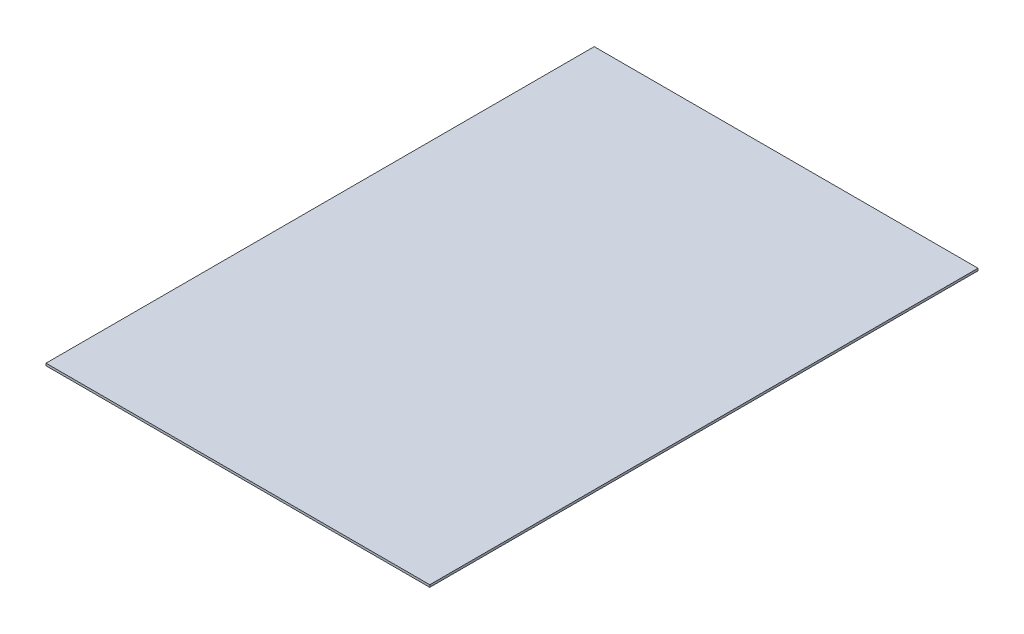
ISO-10303-21;
HEADER;
FILE_DESCRIPTION(('STEP AP214'),'2;1');
FILE_NAME('part.step','',(''),(''),'','','');
FILE_SCHEMA(('AUTOMOTIVE_DESIGN { 1 0 10303 214 1 1 1 1 }'));
ENDSEC;
DATA;
#1=APPLICATION_CONTEXT('core data for automotive mechanical design processes');
#2=APPLICATION_PROTOCOL_DEFINITION('international standard','automotive_design',2000,#1);
#3=PRODUCT_CONTEXT('',#1,'mechanical');
#4=PRODUCT('Part','Part','',(#3));
#5=PRODUCT_RELATED_PRODUCT_CATEGORY('part','',(#4));
#6=PRODUCT_DEFINITION_FORMATION('','',#4);
#7=PRODUCT_DEFINITION_CONTEXT('part definition',#1,'design');
#8=PRODUCT_DEFINITION('design','',#6,#7);
#9=PRODUCT_DEFINITION_SHAPE('','',#8);
#10=(LENGTH_UNIT() NAMED_UNIT(*) SI_UNIT(.MILLI.,.METRE.));
#11=(NAMED_UNIT(*) PLANE_ANGLE_UNIT() SI_UNIT($,.RADIAN.));
#12=(NAMED_UNIT(*) SI_UNIT($,.STERADIAN.) SOLID_ANGLE_UNIT());
#13=UNCERTAINTY_MEASURE_WITH_UNIT(LENGTH_MEASURE(1.E-05),#10,'distance_accuracy_value','');
#14=(GEOMETRIC_REPRESENTATION_CONTEXT(3) GLOBAL_UNCERTAINTY_ASSIGNED_CONTEXT((#13)) GLOBAL_UNIT_ASSIGNED_CONTEXT((#10,
#11,#12)) REPRESENTATION_CONTEXT('',''));
#15=CARTESIAN_POINT('',(0.,0.,0.));
#16=DIRECTION('',(0.,0.,1.));
#17=DIRECTION('',(1.,0.,0.));
#18=AXIS2_PLACEMENT_3D('',#15,#16,#17);
#19=CARTESIAN_POINT('',(-266.7,-28.5749999999999,381.));
#20=DIRECTION('',(0.,0.,-1.));
#21=DIRECTION('',(-1.,0.,0.));
#22=AXIS2_PLACEMENT_3D('',#19,#20,#21);
#23=PLANE('',#22);
#24=DIRECTION('',(-1.,0.,0.));
#25=VECTOR('',#24,1.);
#26=CARTESIAN_POINT('',(-266.7,-25.3999999999998,381.));
#27=LINE('',#26,#25);
#28=CARTESIAN_POINT('',(266.7,-25.3999999999998,381.));
#29=VERTEX_POINT('',#28);
#30=CARTESIAN_POINT('',(-266.7,-25.3999999999998,381.));
#31=VERTEX_POINT('',#30);
#32=EDGE_CURVE('E71',#29,#31,#27,.T.);
#33=ORIENTED_EDGE('',*,*,#32,.T.);
#34=DIRECTION('',(0.,1.,0.));
#35=VECTOR('',#34,1.);
#36=CARTESIAN_POINT('',(-266.7,-28.5749999999999,381.));
#37=LINE('',#36,#35);
#38=CARTESIAN_POINT('',(-266.7,-28.5749999999999,381.));
#39=VERTEX_POINT('',#38);
#40=EDGE_CURVE('E11',#39,#31,#37,.T.);
#41=ORIENTED_EDGE('',*,*,#40,.F.);
#42=DIRECTION('',(-1.,0.,0.));
#43=VECTOR('',#42,1.);
#44=CARTESIAN_POINT('',(0.,-28.5749999999999,381.));
#45=LINE('',#44,#43);
#46=CARTESIAN_POINT('',(266.7,-28.5749999999999,381.));
#47=VERTEX_POINT('',#46);
#48=EDGE_CURVE('E75',#47,#39,#45,.T.);
#49=ORIENTED_EDGE('',*,*,#48,.F.);
#50=DIRECTION('',(0.,1.,0.));
#51=VECTOR('',#50,1.);
#52=CARTESIAN_POINT('',(266.7,-28.5749999999999,381.));
#53=LINE('',#52,#51);
#54=EDGE_CURVE('E95',#47,#29,#53,.T.);
#55=ORIENTED_EDGE('',*,*,#54,.T.);
#56=EDGE_LOOP('',(#33,#41,#49,#55));
#57=FACE_BOUND('',#56,.T.);
#58=ADVANCED_FACE('F35',(#57),#23,.F.);
#59=CARTESIAN_POINT('',(-266.7,-28.5750000000001,-381.));
#60=DIRECTION('',(1.,0.,0.));
#61=DIRECTION('',(0.,0.,-1.));
#62=AXIS2_PLACEMENT_3D('',#59,#60,#61);
#63=PLANE('',#62);
#64=DIRECTION('',(0.,0.,-1.));
#65=VECTOR('',#64,1.);
#66=CARTESIAN_POINT('',(-266.7,-25.4000000000001,-381.));
#67=LINE('',#66,#65);
#68=CARTESIAN_POINT('',(-266.7,-25.4000000000001,-381.));
#69=VERTEX_POINT('',#68);
#70=EDGE_CURVE('E89',#31,#69,#67,.T.);
#71=ORIENTED_EDGE('',*,*,#70,.T.);
#72=DIRECTION('',(0.,1.,0.));
#73=VECTOR('',#72,1.);
#74=CARTESIAN_POINT('',(-266.7,-28.5750000000001,-381.));
#75=LINE('',#74,#73);
#76=CARTESIAN_POINT('',(-266.7,-28.5750000000001,-381.));
#77=VERTEX_POINT('',#76);
#78=EDGE_CURVE('E43',#77,#69,#75,.T.);
#79=ORIENTED_EDGE('',*,*,#78,.F.);
#80=DIRECTION('',(0.,0.,-1.));
#81=VECTOR('',#80,1.);
#82=CARTESIAN_POINT('',(-266.7,-28.5750000000001,-381.));
#83=LINE('',#82,#81);
#84=EDGE_CURVE('E78',#39,#77,#83,.T.);
#85=ORIENTED_EDGE('',*,*,#84,.F.);
#86=ORIENTED_EDGE('',*,*,#40,.T.);
#87=EDGE_LOOP('',(#71,#79,#85,#86));
#88=FACE_BOUND('',#87,.T.);
#89=ADVANCED_FACE('F88',(#88),#63,.F.);
#90=CARTESIAN_POINT('',(266.7,-28.5750000000001,-381.));
#91=DIRECTION('',(0.,0.,1.));
#92=DIRECTION('',(0.,-1.,0.));
#93=AXIS2_PLACEMENT_3D('',#90,#91,#92);
#94=PLANE('',#93);
#95=DIRECTION('',(1.,0.,0.));
#96=VECTOR('',#95,1.);
#97=CARTESIAN_POINT('',(266.7,-25.4000000000001,-381.));
#98=LINE('',#97,#96);
#99=CARTESIAN_POINT('',(266.7,-25.4000000000001,-381.));
#100=VERTEX_POINT('',#99);
#101=EDGE_CURVE('E101',#69,#100,#98,.T.);
#102=ORIENTED_EDGE('',*,*,#101,.T.);
#103=DIRECTION('',(0.,1.,0.));
#104=VECTOR('',#103,1.);
#105=CARTESIAN_POINT('',(266.7,-28.5750000000001,-381.));
#106=LINE('',#105,#104);
#107=CARTESIAN_POINT('',(266.7,-28.5750000000001,-381.));
#108=VERTEX_POINT('',#107);
#109=EDGE_CURVE('E91',#108,#100,#106,.T.);
#110=ORIENTED_EDGE('',*,*,#109,.F.);
#111=DIRECTION('',(1.,0.,0.));
#112=VECTOR('',#111,1.);
#113=CARTESIAN_POINT('',(0.,-28.5750000000001,-381.));
#114=LINE('',#113,#112);
#115=EDGE_CURVE('E82',#77,#108,#114,.T.);
#116=ORIENTED_EDGE('',*,*,#115,.F.);
#117=ORIENTED_EDGE('',*,*,#78,.T.);
#118=EDGE_LOOP('',(#102,#110,#116,#117));
#119=FACE_BOUND('',#118,.T.);
#120=ADVANCED_FACE('F92',(#119),#94,.F.);
#121=CARTESIAN_POINT('',(266.7,-28.5749999999999,381.));
#122=DIRECTION('',(-1.,0.,0.));
#123=DIRECTION('',(0.,0.,1.));
#124=AXIS2_PLACEMENT_3D('',#121,#122,#123);
#125=PLANE('',#124);
#126=DIRECTION('',(0.,0.,1.));
#127=VECTOR('',#126,1.);
#128=CARTESIAN_POINT('',(266.7,-25.3999999999998,381.));
#129=LINE('',#128,#127);
#130=EDGE_CURVE('E67',#100,#29,#129,.T.);
#131=ORIENTED_EDGE('',*,*,#130,.T.);
#132=ORIENTED_EDGE('',*,*,#54,.F.);
#133=DIRECTION('',(0.,0.,1.));
#134=VECTOR('',#133,1.);
#135=CARTESIAN_POINT('',(266.7,-28.575,0.));
#136=LINE('',#135,#134);
#137=EDGE_CURVE('E51',#108,#47,#136,.T.);
#138=ORIENTED_EDGE('',*,*,#137,.F.);
#139=ORIENTED_EDGE('',*,*,#109,.T.);
#140=EDGE_LOOP('',(#131,#132,#138,#139));
#141=FACE_BOUND('',#140,.T.);
#142=ADVANCED_FACE('F107',(#141),#125,.F.);
#143=CARTESIAN_POINT('',(0.,-28.575,0.));
#144=DIRECTION('',(0.,1.,0.));
#145=DIRECTION('',(0.,0.,1.));
#146=AXIS2_PLACEMENT_3D('',#143,#144,#145);
#147=PLANE('',#146);
#148=ORIENTED_EDGE('',*,*,#48,.T.);
#149=ORIENTED_EDGE('',*,*,#84,.T.);
#150=ORIENTED_EDGE('',*,*,#115,.T.);
#151=ORIENTED_EDGE('',*,*,#137,.T.);
#152=EDGE_LOOP('',(#148,#149,#150,#151));
#153=FACE_BOUND('',#152,.T.);
#154=ADVANCED_FACE('F80',(#153),#147,.F.);
#155=CARTESIAN_POINT('',(0.,-25.4,0.));
#156=DIRECTION('',(0.,1.,0.));
#157=DIRECTION('',(0.,0.,1.));
#158=AXIS2_PLACEMENT_3D('',#155,#156,#157);
#159=PLANE('',#158);
#160=ORIENTED_EDGE('',*,*,#32,.F.);
#161=ORIENTED_EDGE('',*,*,#130,.F.);
#162=ORIENTED_EDGE('',*,*,#101,.F.);
#163=ORIENTED_EDGE('',*,*,#70,.F.);
#164=EDGE_LOOP('',(#160,#161,#162,#163));
#165=FACE_BOUND('',#164,.T.);
#166=ADVANCED_FACE('F109',(#165),#159,.T.);
#167=CLOSED_SHELL('',(#58,#89,#120,#142,#154,#166));
#168=MANIFOLD_SOLID_BREP('B2',#167);
#169=ADVANCED_BREP_SHAPE_REPRESENTATION('',(#18,#168),#14);
#170=SHAPE_DEFINITION_REPRESENTATION(#9,#169);
ENDSEC;
END-ISO-10303-21;
